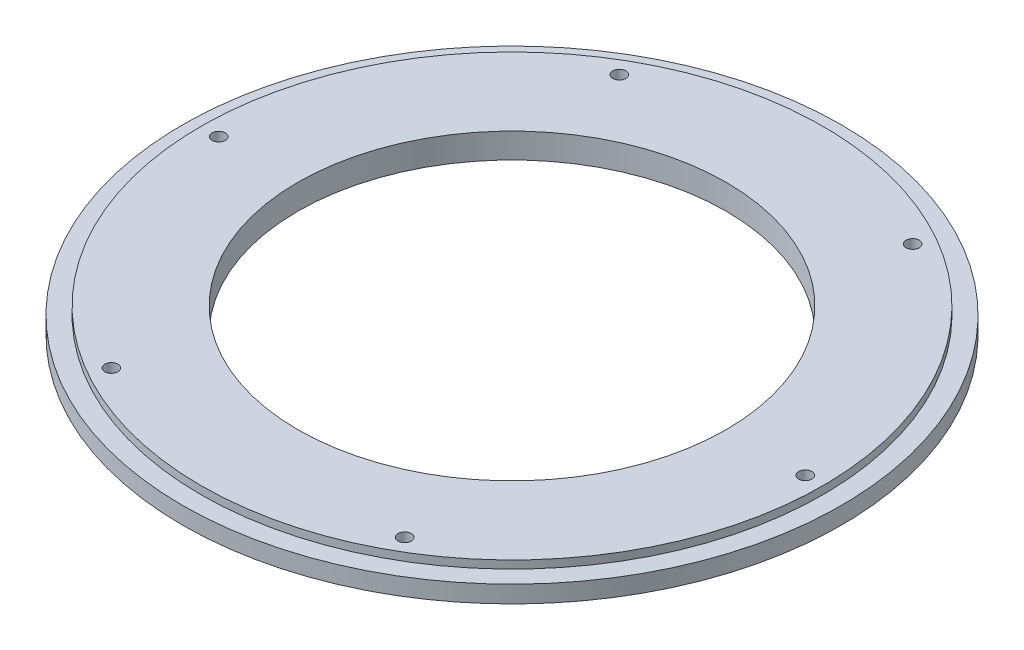
ISO-10303-21;
HEADER;
FILE_DESCRIPTION(('STEP AP214'),'2;1');
FILE_NAME('part.step','',(''),(''),'','','');
FILE_SCHEMA(('AUTOMOTIVE_DESIGN { 1 0 10303 214 1 1 1 1 }'));
ENDSEC;
DATA;
#1=APPLICATION_CONTEXT('core data for automotive mechanical design processes');
#2=APPLICATION_PROTOCOL_DEFINITION('international standard','automotive_design',2000,#1);
#3=PRODUCT_CONTEXT('',#1,'mechanical');
#4=PRODUCT('Part','Part','',(#3));
#5=PRODUCT_RELATED_PRODUCT_CATEGORY('part','',(#4));
#6=PRODUCT_DEFINITION_FORMATION('','',#4);
#7=PRODUCT_DEFINITION_CONTEXT('part definition',#1,'design');
#8=PRODUCT_DEFINITION('design','',#6,#7);
#9=PRODUCT_DEFINITION_SHAPE('','',#8);
#10=(LENGTH_UNIT() NAMED_UNIT(*) SI_UNIT(.MILLI.,.METRE.));
#11=(NAMED_UNIT(*) PLANE_ANGLE_UNIT() SI_UNIT($,.RADIAN.));
#12=(NAMED_UNIT(*) SI_UNIT($,.STERADIAN.) SOLID_ANGLE_UNIT());
#13=UNCERTAINTY_MEASURE_WITH_UNIT(LENGTH_MEASURE(1.E-05),#10,'distance_accuracy_value','');
#14=(GEOMETRIC_REPRESENTATION_CONTEXT(3) GLOBAL_UNCERTAINTY_ASSIGNED_CONTEXT((#13)) GLOBAL_UNIT_ASSIGNED_CONTEXT((#10,
#11,#12)) REPRESENTATION_CONTEXT('',''));
#15=CARTESIAN_POINT('',(0.,0.,0.));
#16=DIRECTION('',(0.,0.,1.));
#17=DIRECTION('',(1.,0.,0.));
#18=AXIS2_PLACEMENT_3D('',#15,#16,#17);
#19=CARTESIAN_POINT('',(0.,19.,0.));
#20=DIRECTION('',(0.,1.,0.));
#21=DIRECTION('',(0.,0.,1.));
#22=AXIS2_PLACEMENT_3D('',#19,#20,#21);
#23=PLANE('',#22);
#24=CARTESIAN_POINT('',(-222.5,19.,1.55431223447522E-12));
#25=DIRECTION('',(0.,1.,0.));
#26=DIRECTION('',(0.,0.,-1.));
#27=AXIS2_PLACEMENT_3D('',#24,#25,#26);
#28=CIRCLE('',#27,4.99999999999992);
#29=CARTESIAN_POINT('',(-222.5,19.,-4.99999999999837));
#30=VERTEX_POINT('',#29);
#31=EDGE_CURVE('E86',#30,#30,#28,.T.);
#32=ORIENTED_EDGE('',*,*,#31,.F.);
#33=EDGE_LOOP('',(#32));
#34=FACE_BOUND('',#33,.T.);
#35=CARTESIAN_POINT('',(-111.250000000001,19.,-192.690652342037));
#36=DIRECTION('',(0.,1.,0.));
#37=DIRECTION('',(0.,0.,-1.));
#38=AXIS2_PLACEMENT_3D('',#35,#36,#37);
#39=CIRCLE('',#38,5.00000000000001);
#40=CARTESIAN_POINT('',(-111.250000000001,19.,-197.690652342037));
#41=VERTEX_POINT('',#40);
#42=EDGE_CURVE('E94',#41,#41,#39,.T.);
#43=ORIENTED_EDGE('',*,*,#42,.F.);
#44=EDGE_LOOP('',(#43));
#45=FACE_BOUND('',#44,.T.);
#46=CARTESIAN_POINT('',(-111.249999999999,19.,192.690652342038));
#47=DIRECTION('',(0.,1.,0.));
#48=DIRECTION('',(0.,0.,1.));
#49=AXIS2_PLACEMENT_3D('',#46,#47,#48);
#50=CIRCLE('',#49,5.00000000000004);
#51=CARTESIAN_POINT('',(-111.249999999999,19.,197.690652342038));
#52=VERTEX_POINT('',#51);
#53=EDGE_CURVE('E102',#52,#52,#50,.T.);
#54=ORIENTED_EDGE('',*,*,#53,.F.);
#55=EDGE_LOOP('',(#54));
#56=FACE_BOUND('',#55,.T.);
#57=CARTESIAN_POINT('',(222.5,19.,0.));
#58=DIRECTION('',(0.,1.,0.));
#59=DIRECTION('',(0.,0.,1.));
#60=AXIS2_PLACEMENT_3D('',#57,#58,#59);
#61=CIRCLE('',#60,4.99999999999999);
#62=CARTESIAN_POINT('',(222.5,19.,4.99999999999999));
#63=VERTEX_POINT('',#62);
#64=EDGE_CURVE('E110',#63,#63,#61,.T.);
#65=ORIENTED_EDGE('',*,*,#64,.F.);
#66=EDGE_LOOP('',(#65));
#67=FACE_BOUND('',#66,.T.);
#68=CARTESIAN_POINT('',(111.25,19.,192.690652342038));
#69=DIRECTION('',(0.,1.,0.));
#70=DIRECTION('',(0.,0.,-1.));
#71=AXIS2_PLACEMENT_3D('',#68,#69,#70);
#72=CIRCLE('',#71,5.00000000000001);
#73=CARTESIAN_POINT('',(111.25,19.,187.690652342038));
#74=VERTEX_POINT('',#73);
#75=EDGE_CURVE('E118',#74,#74,#72,.T.);
#76=ORIENTED_EDGE('',*,*,#75,.F.);
#77=EDGE_LOOP('',(#76));
#78=FACE_BOUND('',#77,.T.);
#79=CARTESIAN_POINT('',(111.25,19.,-192.690652342038));
#80=DIRECTION('',(0.,1.,0.));
#81=DIRECTION('',(0.,0.,1.));
#82=AXIS2_PLACEMENT_3D('',#79,#80,#81);
#83=CIRCLE('',#82,5.00000000000001);
#84=CARTESIAN_POINT('',(111.25,19.,-187.690652342038));
#85=VERTEX_POINT('',#84);
#86=EDGE_CURVE('E78',#85,#85,#83,.T.);
#87=ORIENTED_EDGE('',*,*,#86,.F.);
#88=EDGE_LOOP('',(#87));
#89=FACE_BOUND('',#88,.T.);
#90=CARTESIAN_POINT('',(0.,19.,0.));
#91=DIRECTION('',(0.,1.,0.));
#92=DIRECTION('',(0.,0.,1.));
#93=AXIS2_PLACEMENT_3D('',#90,#91,#92);
#94=CIRCLE('',#93,162.5);
#95=CARTESIAN_POINT('',(0.,19.,162.5));
#96=VERTEX_POINT('',#95);
#97=EDGE_CURVE('E49',#96,#96,#94,.T.);
#98=ORIENTED_EDGE('',*,*,#97,.F.);
#99=EDGE_LOOP('',(#98));
#100=FACE_BOUND('',#99,.T.);
#101=CARTESIAN_POINT('',(0.,19.,0.));
#102=DIRECTION('',(0.,1.,0.));
#103=DIRECTION('',(0.,0.,1.));
#104=AXIS2_PLACEMENT_3D('',#101,#102,#103);
#105=CIRCLE('',#104,236.);
#106=CARTESIAN_POINT('',(0.,19.,236.));
#107=VERTEX_POINT('',#106);
#108=EDGE_CURVE('E70',#107,#107,#105,.T.);
#109=ORIENTED_EDGE('',*,*,#108,.T.);
#110=EDGE_LOOP('',(#109));
#111=FACE_BOUND('',#110,.T.);
#112=ADVANCED_FACE('F41',(#34,#45,#56,#67,#78,#89,#100,#111),#23,.T.);
#113=CARTESIAN_POINT('',(0.,19.,0.));
#114=DIRECTION('',(0.,-1.,0.));
#115=DIRECTION('',(0.,0.,-1.));
#116=AXIS2_PLACEMENT_3D('',#113,#114,#115);
#117=CYLINDRICAL_SURFACE('',#116,250.);
#118=CARTESIAN_POINT('',(0.,0.,0.));
#119=DIRECTION('',(0.,1.,0.));
#120=DIRECTION('',(0.,0.,1.));
#121=AXIS2_PLACEMENT_3D('',#118,#119,#120);
#122=CIRCLE('',#121,250.);
#123=CARTESIAN_POINT('',(0.,0.,250.));
#124=VERTEX_POINT('',#123);
#125=EDGE_CURVE('E10',#124,#124,#122,.T.);
#126=ORIENTED_EDGE('',*,*,#125,.T.);
#127=EDGE_LOOP('',(#126));
#128=FACE_BOUND('',#127,.T.);
#129=CARTESIAN_POINT('',(0.,13.,0.));
#130=DIRECTION('',(0.,1.,0.));
#131=DIRECTION('',(0.,0.,1.));
#132=AXIS2_PLACEMENT_3D('',#129,#130,#131);
#133=CIRCLE('',#132,250.);
#134=CARTESIAN_POINT('',(0.,13.,250.));
#135=VERTEX_POINT('',#134);
#136=EDGE_CURVE('E64',#135,#135,#133,.T.);
#137=ORIENTED_EDGE('',*,*,#136,.F.);
#138=EDGE_LOOP('',(#137));
#139=FACE_BOUND('',#138,.T.);
#140=ADVANCED_FACE('F43',(#128,#139),#117,.T.);
#141=CARTESIAN_POINT('',(0.,0.,0.));
#142=DIRECTION('',(0.,1.,0.));
#143=DIRECTION('',(0.,0.,1.));
#144=AXIS2_PLACEMENT_3D('',#141,#142,#143);
#145=PLANE('',#144);
#146=CARTESIAN_POINT('',(-222.5,0.,1.55431223447522E-12));
#147=DIRECTION('',(0.,1.,0.));
#148=DIRECTION('',(0.,0.,-1.));
#149=AXIS2_PLACEMENT_3D('',#146,#147,#148);
#150=CIRCLE('',#149,4.99999999999992);
#151=CARTESIAN_POINT('',(-222.5,0.,-4.99999999999837));
#152=VERTEX_POINT('',#151);
#153=EDGE_CURVE('E90',#152,#152,#150,.T.);
#154=ORIENTED_EDGE('',*,*,#153,.T.);
#155=EDGE_LOOP('',(#154));
#156=FACE_BOUND('',#155,.T.);
#157=CARTESIAN_POINT('',(-111.250000000001,0.,-192.690652342037));
#158=DIRECTION('',(0.,1.,0.));
#159=DIRECTION('',(0.,0.,-1.));
#160=AXIS2_PLACEMENT_3D('',#157,#158,#159);
#161=CIRCLE('',#160,5.00000000000001);
#162=CARTESIAN_POINT('',(-111.250000000001,0.,-197.690652342037));
#163=VERTEX_POINT('',#162);
#164=EDGE_CURVE('E98',#163,#163,#161,.T.);
#165=ORIENTED_EDGE('',*,*,#164,.T.);
#166=EDGE_LOOP('',(#165));
#167=FACE_BOUND('',#166,.T.);
#168=CARTESIAN_POINT('',(-111.249999999999,0.,192.690652342038));
#169=DIRECTION('',(0.,1.,0.));
#170=DIRECTION('',(0.,0.,1.));
#171=AXIS2_PLACEMENT_3D('',#168,#169,#170);
#172=CIRCLE('',#171,5.00000000000004);
#173=CARTESIAN_POINT('',(-111.249999999999,0.,197.690652342038));
#174=VERTEX_POINT('',#173);
#175=EDGE_CURVE('E106',#174,#174,#172,.T.);
#176=ORIENTED_EDGE('',*,*,#175,.T.);
#177=EDGE_LOOP('',(#176));
#178=FACE_BOUND('',#177,.T.);
#179=CARTESIAN_POINT('',(222.5,0.,0.));
#180=DIRECTION('',(0.,1.,0.));
#181=DIRECTION('',(0.,0.,1.));
#182=AXIS2_PLACEMENT_3D('',#179,#180,#181);
#183=CIRCLE('',#182,4.99999999999999);
#184=CARTESIAN_POINT('',(222.5,0.,4.99999999999999));
#185=VERTEX_POINT('',#184);
#186=EDGE_CURVE('E114',#185,#185,#183,.T.);
#187=ORIENTED_EDGE('',*,*,#186,.T.);
#188=EDGE_LOOP('',(#187));
#189=FACE_BOUND('',#188,.T.);
#190=CARTESIAN_POINT('',(111.25,0.,192.690652342038));
#191=DIRECTION('',(0.,1.,0.));
#192=DIRECTION('',(0.,0.,-1.));
#193=AXIS2_PLACEMENT_3D('',#190,#191,#192);
#194=CIRCLE('',#193,5.00000000000001);
#195=CARTESIAN_POINT('',(111.25,0.,187.690652342038));
#196=VERTEX_POINT('',#195);
#197=EDGE_CURVE('E82',#196,#196,#194,.T.);
#198=ORIENTED_EDGE('',*,*,#197,.T.);
#199=EDGE_LOOP('',(#198));
#200=FACE_BOUND('',#199,.T.);
#201=CARTESIAN_POINT('',(111.25,0.,-192.690652342038));
#202=DIRECTION('',(0.,1.,0.));
#203=DIRECTION('',(0.,0.,1.));
#204=AXIS2_PLACEMENT_3D('',#201,#202,#203);
#205=CIRCLE('',#204,5.00000000000001);
#206=CARTESIAN_POINT('',(111.25,0.,-187.690652342038));
#207=VERTEX_POINT('',#206);
#208=EDGE_CURVE('E74',#207,#207,#205,.T.);
#209=ORIENTED_EDGE('',*,*,#208,.T.);
#210=EDGE_LOOP('',(#209));
#211=FACE_BOUND('',#210,.T.);
#212=ORIENTED_EDGE('',*,*,#125,.F.);
#213=EDGE_LOOP('',(#212));
#214=FACE_BOUND('',#213,.T.);
#215=CARTESIAN_POINT('',(0.,0.,0.));
#216=DIRECTION('',(0.,1.,0.));
#217=DIRECTION('',(0.,0.,1.));
#218=AXIS2_PLACEMENT_3D('',#215,#216,#217);
#219=CIRCLE('',#218,162.5);
#220=CARTESIAN_POINT('',(0.,0.,162.5));
#221=VERTEX_POINT('',#220);
#222=EDGE_CURVE('E56',#221,#221,#219,.T.);
#223=ORIENTED_EDGE('',*,*,#222,.T.);
#224=EDGE_LOOP('',(#223));
#225=FACE_BOUND('',#224,.T.);
#226=ADVANCED_FACE('F128',(#156,#167,#178,#189,#200,#211,#214,#225),#145,.F.);
#227=CARTESIAN_POINT('',(0.,19.,0.));
#228=DIRECTION('',(0.,-1.,0.));
#229=DIRECTION('',(0.,0.,-1.));
#230=AXIS2_PLACEMENT_3D('',#227,#228,#229);
#231=CYLINDRICAL_SURFACE('',#230,162.5);
#232=ORIENTED_EDGE('',*,*,#97,.T.);
#233=EDGE_LOOP('',(#232));
#234=FACE_BOUND('',#233,.T.);
#235=ORIENTED_EDGE('',*,*,#222,.F.);
#236=EDGE_LOOP('',(#235));
#237=FACE_BOUND('',#236,.T.);
#238=ADVANCED_FACE('F159',(#234,#237),#231,.F.);
#239=CARTESIAN_POINT('',(0.,13.,0.));
#240=DIRECTION('',(0.,1.,0.));
#241=DIRECTION('',(0.,0.,1.));
#242=AXIS2_PLACEMENT_3D('',#239,#240,#241);
#243=PLANE('',#242);
#244=CARTESIAN_POINT('',(0.,13.,0.));
#245=DIRECTION('',(0.,1.,0.));
#246=DIRECTION('',(0.,0.,1.));
#247=AXIS2_PLACEMENT_3D('',#244,#245,#246);
#248=CIRCLE('',#247,236.);
#249=CARTESIAN_POINT('',(0.,13.,236.));
#250=VERTEX_POINT('',#249);
#251=EDGE_CURVE('E69',#250,#250,#248,.T.);
#252=ORIENTED_EDGE('',*,*,#251,.F.);
#253=EDGE_LOOP('',(#252));
#254=FACE_BOUND('',#253,.T.);
#255=ORIENTED_EDGE('',*,*,#136,.T.);
#256=EDGE_LOOP('',(#255));
#257=FACE_BOUND('',#256,.T.);
#258=ADVANCED_FACE('F150',(#254,#257),#243,.T.);
#259=CARTESIAN_POINT('',(0.,13.,0.));
#260=DIRECTION('',(0.,1.,0.));
#261=DIRECTION('',(0.,0.,1.));
#262=AXIS2_PLACEMENT_3D('',#259,#260,#261);
#263=CYLINDRICAL_SURFACE('',#262,236.);
#264=ORIENTED_EDGE('',*,*,#251,.T.);
#265=EDGE_LOOP('',(#264));
#266=FACE_BOUND('',#265,.T.);
#267=ORIENTED_EDGE('',*,*,#108,.F.);
#268=EDGE_LOOP('',(#267));
#269=FACE_BOUND('',#268,.T.);
#270=ADVANCED_FACE('F148',(#266,#269),#263,.T.);
#271=CARTESIAN_POINT('',(111.25,0.,-192.690652342038));
#272=DIRECTION('',(0.,1.,0.));
#273=DIRECTION('',(0.,0.,1.));
#274=AXIS2_PLACEMENT_3D('',#271,#272,#273);
#275=CYLINDRICAL_SURFACE('',#274,5.00000000000001);
#276=ORIENTED_EDGE('',*,*,#208,.F.);
#277=EDGE_LOOP('',(#276));
#278=FACE_BOUND('',#277,.T.);
#279=ORIENTED_EDGE('',*,*,#86,.T.);
#280=EDGE_LOOP('',(#279));
#281=FACE_BOUND('',#280,.T.);
#282=ADVANCED_FACE('F135',(#278,#281),#275,.F.);
#283=CARTESIAN_POINT('',(111.25,0.,192.690652342038));
#284=DIRECTION('',(0.,1.,0.));
#285=DIRECTION('',(0.,0.,1.));
#286=AXIS2_PLACEMENT_3D('',#283,#284,#285);
#287=CYLINDRICAL_SURFACE('',#286,5.00000000000001);
#288=ORIENTED_EDGE('',*,*,#197,.F.);
#289=EDGE_LOOP('',(#288));
#290=FACE_BOUND('',#289,.T.);
#291=ORIENTED_EDGE('',*,*,#75,.T.);
#292=EDGE_LOOP('',(#291));
#293=FACE_BOUND('',#292,.T.);
#294=ADVANCED_FACE('F131',(#290,#293),#287,.F.);
#295=CARTESIAN_POINT('',(222.5,0.,0.));
#296=DIRECTION('',(0.,1.,0.));
#297=DIRECTION('',(0.,0.,1.));
#298=AXIS2_PLACEMENT_3D('',#295,#296,#297);
#299=CYLINDRICAL_SURFACE('',#298,4.99999999999999);
#300=ORIENTED_EDGE('',*,*,#186,.F.);
#301=EDGE_LOOP('',(#300));
#302=FACE_BOUND('',#301,.T.);
#303=ORIENTED_EDGE('',*,*,#64,.T.);
#304=EDGE_LOOP('',(#303));
#305=FACE_BOUND('',#304,.T.);
#306=ADVANCED_FACE('F134',(#302,#305),#299,.F.);
#307=CARTESIAN_POINT('',(-111.249999999999,0.,192.690652342038));
#308=DIRECTION('',(0.,1.,0.));
#309=DIRECTION('',(0.,0.,1.));
#310=AXIS2_PLACEMENT_3D('',#307,#308,#309);
#311=CYLINDRICAL_SURFACE('',#310,5.00000000000004);
#312=ORIENTED_EDGE('',*,*,#175,.F.);
#313=EDGE_LOOP('',(#312));
#314=FACE_BOUND('',#313,.T.);
#315=ORIENTED_EDGE('',*,*,#53,.T.);
#316=EDGE_LOOP('',(#315));
#317=FACE_BOUND('',#316,.T.);
#318=ADVANCED_FACE('F180',(#314,#317),#311,.F.);
#319=CARTESIAN_POINT('',(-111.250000000001,0.,-192.690652342037));
#320=DIRECTION('',(0.,1.,0.));
#321=DIRECTION('',(0.,0.,1.));
#322=AXIS2_PLACEMENT_3D('',#319,#320,#321);
#323=CYLINDRICAL_SURFACE('',#322,5.00000000000001);
#324=ORIENTED_EDGE('',*,*,#164,.F.);
#325=EDGE_LOOP('',(#324));
#326=FACE_BOUND('',#325,.T.);
#327=ORIENTED_EDGE('',*,*,#42,.T.);
#328=EDGE_LOOP('',(#327));
#329=FACE_BOUND('',#328,.T.);
#330=ADVANCED_FACE('F187',(#326,#329),#323,.F.);
#331=CARTESIAN_POINT('',(-222.5,0.,1.55431223447522E-12));
#332=DIRECTION('',(0.,1.,0.));
#333=DIRECTION('',(0.,0.,1.));
#334=AXIS2_PLACEMENT_3D('',#331,#332,#333);
#335=CYLINDRICAL_SURFACE('',#334,4.99999999999992);
#336=ORIENTED_EDGE('',*,*,#153,.F.);
#337=EDGE_LOOP('',(#336));
#338=FACE_BOUND('',#337,.T.);
#339=ORIENTED_EDGE('',*,*,#31,.T.);
#340=EDGE_LOOP('',(#339));
#341=FACE_BOUND('',#340,.T.);
#342=ADVANCED_FACE('F192',(#338,#341),#335,.F.);
#343=CLOSED_SHELL('',(#112,#140,#226,#238,#258,#270,#282,#294,#306,#318,#330,#342));
#344=MANIFOLD_SOLID_BREP('B2',#343);
#345=ADVANCED_BREP_SHAPE_REPRESENTATION('',(#18,#344),#14);
#346=SHAPE_DEFINITION_REPRESENTATION(#9,#345);
ENDSEC;
END-ISO-10303-21;
